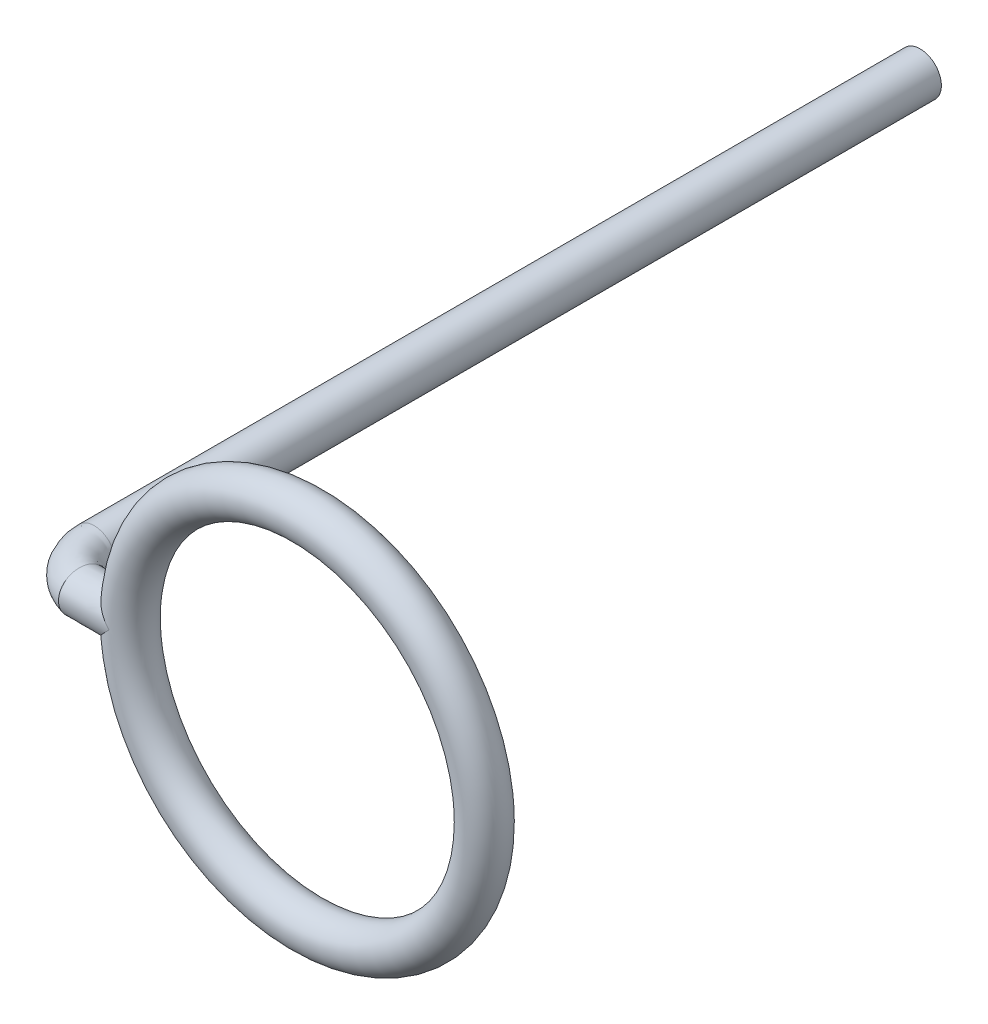
ISO-10303-21;
HEADER;
FILE_DESCRIPTION(('STEP AP214'),'2;1');
FILE_NAME('part.step','',(''),(''),'','','');
FILE_SCHEMA(('AUTOMOTIVE_DESIGN { 1 0 10303 214 1 1 1 1 }'));
ENDSEC;
DATA;
#1=APPLICATION_CONTEXT('core data for automotive mechanical design processes');
#2=APPLICATION_PROTOCOL_DEFINITION('international standard','automotive_design',2000,#1);
#3=PRODUCT_CONTEXT('',#1,'mechanical');
#4=PRODUCT('Part','Part','',(#3));
#5=PRODUCT_RELATED_PRODUCT_CATEGORY('part','',(#4));
#6=PRODUCT_DEFINITION_FORMATION('','',#4);
#7=PRODUCT_DEFINITION_CONTEXT('part definition',#1,'design');
#8=PRODUCT_DEFINITION('design','',#6,#7);
#9=PRODUCT_DEFINITION_SHAPE('','',#8);
#10=(LENGTH_UNIT() NAMED_UNIT(*) SI_UNIT(.MILLI.,.METRE.));
#11=(NAMED_UNIT(*) PLANE_ANGLE_UNIT() SI_UNIT($,.RADIAN.));
#12=(NAMED_UNIT(*) SI_UNIT($,.STERADIAN.) SOLID_ANGLE_UNIT());
#13=UNCERTAINTY_MEASURE_WITH_UNIT(LENGTH_MEASURE(1.E-05),#10,'distance_accuracy_value','');
#14=(GEOMETRIC_REPRESENTATION_CONTEXT(3) GLOBAL_UNCERTAINTY_ASSIGNED_CONTEXT((#13)) GLOBAL_UNIT_ASSIGNED_CONTEXT((#10,
#11,#12)) REPRESENTATION_CONTEXT('',''));
#15=CARTESIAN_POINT('',(0.,0.,0.));
#16=DIRECTION('',(0.,0.,1.));
#17=DIRECTION('',(1.,0.,0.));
#18=AXIS2_PLACEMENT_3D('',#15,#16,#17);
#19=CARTESIAN_POINT('',(0.692087106504282,0.,5.280473238298));
#20=CARTESIAN_POINT('',(1.6204189946439,0.,5.280473238298));
#21=CARTESIAN_POINT('',(0.692087106504282,-0.9,5.280473238298));
#22=CARTESIAN_POINT('',(1.6204189946439,-0.9,5.280473238298));
#23=CARTESIAN_POINT('',(0.548750882783522,-0.9,6.180473238298));
#24=CARTESIAN_POINT('',(1.6204189946439,-0.9,6.180473238298));
#25=CARTESIAN_POINT('',(0.548750882783522,0.,6.180473238298));
#26=CARTESIAN_POINT('',(1.6204189946439,0.,6.180473238298));
#27=CARTESIAN_POINT('',(0.548750882783522,0.9,6.180473238298));
#28=CARTESIAN_POINT('',(1.6204189946439,0.9,6.180473238298));
#29=CARTESIAN_POINT('',(0.692087106504282,0.9,5.280473238298));
#30=CARTESIAN_POINT('',(1.6204189946439,0.9,5.280473238298));
#31=CARTESIAN_POINT('',(0.692087106504282,0.,5.280473238298));
#32=CARTESIAN_POINT('',(1.6204189946439,0.,5.280473238298));
#33=(BOUNDED_SURFACE() B_SPLINE_SURFACE(3,1,((#19,#20),(#21,#22),(#23,#24),(#25,#26),(#27,#28),
(#29,#30),(#31,#32)),.UNSPECIFIED.,.T.,.F.,.F.) B_SPLINE_SURFACE_WITH_KNOTS((4,3,4),(2,2),(0.,
0.5,1.),(0.,1.),.UNSPECIFIED.) GEOMETRIC_REPRESENTATION_ITEM() RATIONAL_B_SPLINE_SURFACE(((1.,
1.),(0.333333333333333,0.333333333333333),(0.333333333333333,0.333333333333333),(1.,1.),
(0.333333333333333,0.333333333333333),(0.333333333333333,0.333333333333333),(1.,1.))) REPRESENTATION_ITEM('') SURFACE());
#34=CARTESIAN_POINT('',(0.692087106504282,0.,5.280473238298));
#35=CARTESIAN_POINT('',(0.692087106504282,-0.9,5.280473238298));
#36=CARTESIAN_POINT('',(0.548750882783522,-0.9,6.180473238298));
#37=CARTESIAN_POINT('',(0.548750882783522,0.,6.180473238298));
#38=CARTESIAN_POINT('',(0.548750882783522,0.9,6.180473238298));
#39=CARTESIAN_POINT('',(0.692087106504282,0.9,5.280473238298));
#40=CARTESIAN_POINT('',(0.692087106504282,0.,5.280473238298));
#41=(BOUNDED_CURVE() B_SPLINE_CURVE(3,(#34,#35,#36,#37,#38,#39,#40),.UNSPECIFIED.,.T.,
.F.) B_SPLINE_CURVE_WITH_KNOTS((4,3,4),(0.,0.5,1.),
.UNSPECIFIED.) CURVE() GEOMETRIC_REPRESENTATION_ITEM() RATIONAL_B_SPLINE_CURVE((1.,
0.333333333333333,0.333333333333333,1.,0.333333333333333,0.333333333333333,1.)) REPRESENTATION_ITEM(''));
#42=CARTESIAN_POINT('',(0.692087106504282,0.,5.280473238298));
#43=VERTEX_POINT('',#42);
#44=EDGE_CURVE('E101',#43,#43,#41,.T.);
#45=CARTESIAN_POINT('',(1.6204189946439,0.,5.280473238298));
#46=CARTESIAN_POINT('',(1.61941904394034,0.000999946876960624,5.28047324780267));
#47=CARTESIAN_POINT('',(1.6184192394614,0.00200015154738658,5.28047658026686));
#48=CARTESIAN_POINT('',(1.58406334565922,0.0363836482557454,5.28070554534993));
#49=CARTESIAN_POINT('',(1.55088460140851,0.070037863780571,5.28463520916479));
#50=CARTESIAN_POINT('',(1.48580900300333,0.136884849147878,5.30042143625995));
#51=CARTESIAN_POINT('',(1.45391435748275,0.17007676467031,5.3122910863468));
#52=CARTESIAN_POINT('',(1.40209298725816,0.22462113528113,5.33974433391434));
#53=CARTESIAN_POINT('',(1.38149986245629,0.246478078776622,5.35306657364809));
#54=CARTESIAN_POINT('',(1.34212986683366,0.288563806025971,5.38418784939207));
#55=CARTESIAN_POINT('',(1.32334931384276,0.308795875977241,5.40197753316593));
#56=CARTESIAN_POINT('',(1.29232278851944,0.342424520449592,5.43771967668645));
#57=CARTESIAN_POINT('',(1.27955731858125,0.35633481212908,5.45473483432355));
#58=CARTESIAN_POINT('',(1.25609635780187,0.382001828345615,5.49156709192732));
#59=CARTESIAN_POINT('',(1.24539654335557,0.393763048260985,5.51137818582118));
#60=CARTESIAN_POINT('',(1.22830966023749,0.412601310692488,5.54982594857071));
#61=CARTESIAN_POINT('',(1.22149399019761,0.420139440516269,5.56804460436168));
#62=CARTESIAN_POINT('',(1.21000368808957,0.432869652899493,5.60589056219817));
#63=CARTESIAN_POINT('',(1.20532419194691,0.438067064913914,5.62551454513834));
#64=CARTESIAN_POINT('',(1.19836007088145,0.445808418696342,5.66583198591937));
#65=CARTESIAN_POINT('',(1.19609053228308,0.448335644624438,5.68653133976306));
#66=CARTESIAN_POINT('',(1.19416723320949,0.450477026420196,5.72820060831059));
#67=CARTESIAN_POINT('',(1.19451271030928,0.450092031365012,5.74917044237427));
#68=CARTESIAN_POINT('',(1.19763995875578,0.446611067684256,5.78876274060493));
#69=CARTESIAN_POINT('',(1.2001985734764,0.443763420056401,5.80742598478644));
#70=CARTESIAN_POINT('',(1.20730383689193,0.43586870444032,5.84390779889929));
#71=CARTESIAN_POINT('',(1.21185322130763,0.430818609876128,5.86172516894683));
#72=CARTESIAN_POINT('',(1.22292219105501,0.418559757229232,5.89680646832661));
#73=CARTESIAN_POINT('',(1.22951274193344,0.411273348302757,5.914020443538));
#74=CARTESIAN_POINT('',(1.244304482224,0.394968807007596,5.94689302038005));
#75=CARTESIAN_POINT('',(1.25250905179435,0.385947041264559,5.96254825216469));
#76=CARTESIAN_POINT('',(1.27439154273928,0.361969700312041,5.99908664082296));
#77=CARTESIAN_POINT('',(1.28883431319464,0.346212723509594,6.01898895451767));
#78=CARTESIAN_POINT('',(1.31981268515193,0.312622630298804,6.05509371462596));
#79=CARTESIAN_POINT('',(1.33635375728122,0.29478409703031,6.07128616745605));
#80=CARTESIAN_POINT('',(1.37688223951206,0.251373249493009,6.1050460895669));
#81=CARTESIAN_POINT('',(1.40147593369138,0.225248976255948,6.12117575427451));
#82=CARTESIAN_POINT('',(1.45233645182983,0.171762547349888,6.14747230854796));
#83=CARTESIAN_POINT('',(1.47860405956399,0.144399813561013,6.15763638176859));
#84=CARTESIAN_POINT('',(1.54201686413544,0.0790441940978801,6.17519381090207));
#85=CARTESIAN_POINT('',(1.5796242701661,0.0408263957298755,6.18021119751048));
#86=CARTESIAN_POINT('',(1.61841926800301,0.00200012019441651,6.18046990047325));
#87=CARTESIAN_POINT('',(1.61941907306654,0.000999914867427577,6.18047323299266));
#88=CARTESIAN_POINT('',(1.6204189946439,0.,6.180473238298));
#89=B_SPLINE_CURVE_WITH_KNOTS('',3,(#45,#46,#47,#48,#49,#50,#51,#52,#53,#54,#55,#56,#57,#58,#59,
#60,#61,#62,#63,#64,#65,#66,#67,#68,#69,#70,#71,#72,#73,#74,#75,#76,#77,#78,#79,#80,#81,#82,#83,
#84,#85,#86,#87,#88),.UNSPECIFIED.,.F.,.F.,(4,2,2,2,2,2,2,2,2,2,2,2,2,2,2,2,2,2,2,2,2,4),(0.,
0.00424265256668993,0.145811875846178,0.287615012502882,0.385852716381518,0.483886457296574,
0.559861709080372,0.635676171371781,0.698003838941149,0.7601888695152,0.822760923770118,
0.885314735434998,0.942211371099444,0.999186441016014,1.05842054661309,1.11778004981022,
1.2049112373805,1.29227444839608,1.40964278906166,1.52706649463792,1.68747128033579,
1.69171393290248),.UNSPECIFIED.);
#90=CARTESIAN_POINT('',(1.6204189946439,0.,5.280473238298));
#91=VERTEX_POINT('',#90);
#92=CARTESIAN_POINT('',(1.6204189946439,0.,6.180473238298));
#93=VERTEX_POINT('',#92);
#94=EDGE_CURVE('E12',#91,#93,#89,.T.);
#95=CARTESIAN_POINT('',(1.6204189946439,0.,5.280473238298));
#96=CARTESIAN_POINT('',(1.61941904394034,-0.000999946876960653,5.28047324780267));
#97=CARTESIAN_POINT('',(1.6184192394614,-0.0020001515473866,5.28047658026686));
#98=CARTESIAN_POINT('',(1.58406334565923,-0.0363836482557363,5.28070554534993));
#99=CARTESIAN_POINT('',(1.55088460140849,-0.0700378637805496,5.2846352091647));
#100=CARTESIAN_POINT('',(1.48580900300341,-0.136884849147847,5.30042143626004));
#101=CARTESIAN_POINT('',(1.45391435748295,-0.170076764670282,5.31229108634716));
#102=CARTESIAN_POINT('',(1.40209298725829,-0.224621135281125,5.33974433391461));
#103=CARTESIAN_POINT('',(1.38149986245632,-0.246478078776632,5.35306657364817));
#104=CARTESIAN_POINT('',(1.34212986683361,-0.288563806025985,5.38418784939201));
#105=CARTESIAN_POINT('',(1.32334931384275,-0.308795875977245,5.40197753316592));
#106=CARTESIAN_POINT('',(1.29232278851945,-0.342424520449591,5.43771967668646));
#107=CARTESIAN_POINT('',(1.27955731858125,-0.356334812129081,5.45473483432356));
#108=CARTESIAN_POINT('',(1.25609635780186,-0.382001828345617,5.49156709192731));
#109=CARTESIAN_POINT('',(1.24539654335556,-0.393763048260986,5.51137818582118));
#110=CARTESIAN_POINT('',(1.22830966023749,-0.412601310692487,5.54982594857071));
#111=CARTESIAN_POINT('',(1.22149399019761,-0.420139440516268,5.56804460436167));
#112=CARTESIAN_POINT('',(1.21000368808957,-0.432869652899493,5.60589056219816));
#113=CARTESIAN_POINT('',(1.20532419194691,-0.438067064913914,5.62551454513834));
#114=CARTESIAN_POINT('',(1.19836007088145,-0.445808418696342,5.66583198591937));
#115=CARTESIAN_POINT('',(1.19609053228308,-0.448335644624438,5.68653133976306));
#116=CARTESIAN_POINT('',(1.19416723320949,-0.450477026420196,5.72820060831059));
#117=CARTESIAN_POINT('',(1.19451271030928,-0.450092031365012,5.74917044237427));
#118=CARTESIAN_POINT('',(1.19763995875578,-0.446611067684255,5.78876274060494));
#119=CARTESIAN_POINT('',(1.2001985734764,-0.4437634200564,5.80742598478645));
#120=CARTESIAN_POINT('',(1.20730383689193,-0.435868704440319,5.84390779889929));
#121=CARTESIAN_POINT('',(1.21185322130763,-0.430818609876127,5.86172516894684));
#122=CARTESIAN_POINT('',(1.22292219105501,-0.41855975722923,5.89680646832661));
#123=CARTESIAN_POINT('',(1.22951274193345,-0.411273348302756,5.914020443538));
#124=CARTESIAN_POINT('',(1.244304482224,-0.394968807007594,5.94689302038005));
#125=CARTESIAN_POINT('',(1.25250905179435,-0.385947041264556,5.96254825216469));
#126=CARTESIAN_POINT('',(1.27439154273928,-0.361969700312038,5.99908664082296));
#127=CARTESIAN_POINT('',(1.28883431319464,-0.346212723509591,6.01898895451767));
#128=CARTESIAN_POINT('',(1.31981268515194,-0.312622630298801,6.05509371462597));
#129=CARTESIAN_POINT('',(1.33635375728123,-0.294784097030305,6.07128616745605));
#130=CARTESIAN_POINT('',(1.37688223951207,-0.251373249493002,6.10504608956691));
#131=CARTESIAN_POINT('',(1.40147593369138,-0.225248976255941,6.12117575427451));
#132=CARTESIAN_POINT('',(1.45233645182983,-0.171762547349877,6.14747230854797));
#133=CARTESIAN_POINT('',(1.47860405956399,-0.144399813560998,6.15763638176859));
#134=CARTESIAN_POINT('',(1.54201686413546,-0.0790441940978838,6.17519381090206));
#135=CARTESIAN_POINT('',(1.57962427016614,-0.0408263957299113,6.18021119751044));
#136=CARTESIAN_POINT('',(1.61841926800301,-0.00200012019441843,6.18046990047325));
#137=CARTESIAN_POINT('',(1.61941907306654,-0.000999914867428478,6.18047323299266));
#138=CARTESIAN_POINT('',(1.6204189946439,0.,6.180473238298));
#139=B_SPLINE_CURVE_WITH_KNOTS('',3,(#95,#96,#97,#98,#99,#100,#101,#102,#103,#104,#105,#106,
#107,#108,#109,#110,#111,#112,#113,#114,#115,#116,#117,#118,#119,#120,#121,#122,#123,#124,#125,
#126,#127,#128,#129,#130,#131,#132,#133,#134,#135,#136,#137,#138),.UNSPECIFIED.,.F.,.F.,(4,2,2,
2,2,2,2,2,2,2,2,2,2,2,2,2,2,2,2,2,2,4),(0.,0.00424265256668962,0.145811875846129,
0.287615012502841,0.385852716381489,0.483886457296516,0.559861709080321,0.635676171371725,
0.698003838941092,0.760188869515146,0.822760923770065,0.885314735434947,0.942211371099393,
0.999186441015962,1.05842054661304,1.11778004981017,1.20491123738045,1.29227444839603,
1.40964278906162,1.52706649463787,1.68747128033573,1.69171393290242),.UNSPECIFIED.);
#140=EDGE_CURVE('E52',#93,#91,#139,.F.);
#141=ORIENTED_EDGE('',*,*,#44,.F.);
#142=EDGE_LOOP('',(#141));
#143=FACE_BOUND('',#142,.T.);
#144=ORIENTED_EDGE('',*,*,#94,.F.);
#145=ORIENTED_EDGE('',*,*,#140,.F.);
#146=EDGE_LOOP('',(#144,#145));
#147=FACE_BOUND('',#146,.T.);
#148=ADVANCED_FACE('F39',(#143,#147),#33,.F.);
#149=CARTESIAN_POINT('',(0.,0.,4.875));
#150=DIRECTION('',(0.,0.,-1.));
#151=DIRECTION('',(-1.,0.,0.));
#152=AXIS2_PLACEMENT_3D('',#149,#150,#151);
#153=CYLINDRICAL_SURFACE('',#152,0.45);
#154=CARTESIAN_POINT('',(0.,0.,4.875));
#155=DIRECTION('',(0.,0.,1.));
#156=DIRECTION('',(1.,0.,0.));
#157=AXIS2_PLACEMENT_3D('',#154,#155,#156);
#158=CIRCLE('',#157,0.45);
#159=CARTESIAN_POINT('',(0.45,0.,4.875));
#160=VERTEX_POINT('',#159);
#161=EDGE_CURVE('E60',#160,#160,#158,.T.);
#162=ORIENTED_EDGE('',*,*,#161,.F.);
#163=EDGE_LOOP('',(#162));
#164=FACE_BOUND('',#163,.T.);
#165=CARTESIAN_POINT('',(0.,0.,-12.625));
#166=DIRECTION('',(0.,0.,1.));
#167=DIRECTION('',(1.,0.,0.));
#168=AXIS2_PLACEMENT_3D('',#165,#166,#167);
#169=CIRCLE('',#168,0.45);
#170=CARTESIAN_POINT('',(0.45,0.,-12.625));
#171=VERTEX_POINT('',#170);
#172=EDGE_CURVE('E62',#171,#171,#169,.T.);
#173=ORIENTED_EDGE('',*,*,#172,.T.);
#174=EDGE_LOOP('',(#173));
#175=FACE_BOUND('',#174,.T.);
#176=ADVANCED_FACE('F41',(#164,#175),#153,.T.);
#177=CARTESIAN_POINT('',(0.,0.,-12.625));
#178=DIRECTION('',(0.,0.,1.));
#179=DIRECTION('',(1.,0.,0.));
#180=AXIS2_PLACEMENT_3D('',#177,#178,#179);
#181=PLANE('',#180);
#182=ORIENTED_EDGE('',*,*,#172,.F.);
#183=EDGE_LOOP('',(#182));
#184=FACE_BOUND('',#183,.T.);
#185=ADVANCED_FACE('F85',(#184),#181,.F.);
#186=CARTESIAN_POINT('',(0.45,0.,4.875));
#187=CARTESIAN_POINT('',(0.45,0.,4.94284415358782));
#188=CARTESIAN_POINT('',(0.456282728459389,0.,4.94431537626742));
#189=CARTESIAN_POINT('',(0.486321521665883,0.,5.06596935075954));
#190=CARTESIAN_POINT('',(0.52816734089369,0.,5.1327897767991));
#191=CARTESIAN_POINT('',(0.573868134181102,0.,5.19465223346691));
#192=CARTESIAN_POINT('',(0.652079858365823,0.,5.24742595508101));
#193=CARTESIAN_POINT('',(0.641468262870593,0.,5.26393026937798));
#194=CARTESIAN_POINT('',(0.692087106504283,0.,5.280473238298));
#195=CARTESIAN_POINT('',(0.45,0.9,4.875));
#196=CARTESIAN_POINT('',(0.45,0.9,5.05789190931659));
#197=CARTESIAN_POINT('',(0.456615773705222,0.9,4.88825065190883));
#198=CARTESIAN_POINT('',(0.485086463503013,0.9,5.08128264866202));
#199=CARTESIAN_POINT('',(0.532387407509551,0.9,5.13094128155833));
#200=CARTESIAN_POINT('',(0.561978408903085,0.9,5.19152912770658));
#201=CARTESIAN_POINT('',(0.695112978059704,0.9,5.26128344342246));
#202=CARTESIAN_POINT('',(0.552712243855055,0.9,5.23492352092944));
#203=CARTESIAN_POINT('',(0.692087106504283,0.9,5.280473238298));
#204=CARTESIAN_POINT('',(-0.45,0.9,4.875));
#205=CARTESIAN_POINT('',(-0.45,0.9,5.05789190931659));
#206=CARTESIAN_POINT('',(-0.421207291257578,0.9,5.16481407245347));
#207=CARTESIAN_POINT('',(-0.311393454863875,0.9,5.51254474159091));
#208=CARTESIAN_POINT('',(-0.125647612043174,0.9,5.767701168994));
#209=CARTESIAN_POINT('',(0.079885783254905,0.9,5.9600777116774));
#210=CARTESIAN_POINT('',(0.330992895222854,0.9,6.10686187936765));
#211=CARTESIAN_POINT('',(0.409376020134295,0.9,6.13492352092944));
#212=CARTESIAN_POINT('',(0.548750882783522,0.9,6.180473238298));
#213=CARTESIAN_POINT('',(-0.45,0.,4.875));
#214=CARTESIAN_POINT('',(-0.45,0.,5.00036803145221));
#215=CARTESIAN_POINT('',(-0.421373813880494,0.,5.19284643463276));
#216=CARTESIAN_POINT('',(-0.310775925782441,0.,5.50488809263967));
#217=CARTESIAN_POINT('',(-0.127757645351105,0.,5.76862541661439));
#218=CARTESIAN_POINT('',(0.0858306458939142,0.,5.96163926455756));
#219=CARTESIAN_POINT('',(0.309476335375912,0.,6.09993313519693));
#220=CARTESIAN_POINT('',(0.453754029642064,0.,6.14942689515371));
#221=CARTESIAN_POINT('',(0.548750882783522,0.,6.180473238298));
#222=CARTESIAN_POINT('',(-0.45,-0.9,4.875));
#223=CARTESIAN_POINT('',(-0.45,-0.9,4.94284415358782));
#224=CARTESIAN_POINT('',(-0.421540336503411,-0.9,5.22087879681206));
#225=CARTESIAN_POINT('',(-0.310158396701006,-0.9,5.49723144368843));
#226=CARTESIAN_POINT('',(-0.129867678659036,-0.9,5.76954966423477));
#227=CARTESIAN_POINT('',(0.0917755085329233,-0.9,5.96320081743772));
#228=CARTESIAN_POINT('',(0.287959775528972,-0.9,6.09300439102621));
#229=CARTESIAN_POINT('',(0.498132039149833,-0.9,6.16393026937798));
#230=CARTESIAN_POINT('',(0.548750882783522,-0.9,6.180473238298));
#231=CARTESIAN_POINT('',(0.45,-0.9,4.875));
#232=CARTESIAN_POINT('',(0.45,-0.9,4.82779639785905));
#233=CARTESIAN_POINT('',(0.455949683213556,-0.9,5.00038010062602));
#234=CARTESIAN_POINT('',(0.487556579828751,-0.9,5.05065605285706));
#235=CARTESIAN_POINT('',(0.523947274277827,-0.9,5.13463827203988));
#236=CARTESIAN_POINT('',(0.585757859459121,-0.9,5.19777533922722));
#237=CARTESIAN_POINT('',(0.609046738671941,-0.9,5.23356846673957));
#238=CARTESIAN_POINT('',(0.730224281886131,-0.9,5.29293701782653));
#239=CARTESIAN_POINT('',(0.692087106504283,-0.9,5.280473238298));
#240=CARTESIAN_POINT('',(0.45,0.,4.875));
#241=CARTESIAN_POINT('',(0.45,0.,4.94284415358782));
#242=CARTESIAN_POINT('',(0.456282728459389,0.,4.94431537626742));
#243=CARTESIAN_POINT('',(0.486321521665883,0.,5.06596935075954));
#244=CARTESIAN_POINT('',(0.52816734089369,0.,5.1327897767991));
#245=CARTESIAN_POINT('',(0.573868134181102,0.,5.19465223346691));
#246=CARTESIAN_POINT('',(0.652079858365823,0.,5.24742595508101));
#247=CARTESIAN_POINT('',(0.641468262870593,0.,5.26393026937798));
#248=CARTESIAN_POINT('',(0.692087106504283,0.,5.280473238298));
#249=(BOUNDED_SURFACE() B_SPLINE_SURFACE(3,3,((#186,#187,#188,#189,#190,#191,#192,#193,#194),
(#195,#196,#197,#198,#199,#200,#201,#202,#203),(#204,#205,#206,#207,#208,#209,#210,#211,#212),
(#213,#214,#215,#216,#217,#218,#219,#220,#221),(#222,#223,#224,#225,#226,#227,#228,#229,#230),
(#231,#232,#233,#234,#235,#236,#237,#238,#239),(#240,#241,#242,#243,#244,#245,#246,#247,#248)),
.UNSPECIFIED.,.T.,.F.,.F.) B_SPLINE_SURFACE_WITH_KNOTS((4,3,4),(4,1,1,1,1,1,4),(0.,0.5,1.),(0.,
0.180308680805076,0.369593476277659,0.561429421360296,0.711540361964005,0.858891388172645,1.),
.UNSPECIFIED.) GEOMETRIC_REPRESENTATION_ITEM() RATIONAL_B_SPLINE_SURFACE(((1.,1.,1.,1.,1.,1.,1.,
1.,1.),(0.333333333333333,0.333333333333333,0.333333333333333,0.333333333333333,
0.333333333333333,0.333333333333333,0.333333333333333,0.333333333333333,0.333333333333333),
(0.333333333333333,0.333333333333333,0.333333333333333,0.333333333333333,0.333333333333333,
0.333333333333333,0.333333333333333,0.333333333333333,0.333333333333333),(1.,1.,1.,1.,1.,1.,1.,
1.,1.),(0.333333333333333,0.333333333333333,0.333333333333333,0.333333333333333,
0.333333333333333,0.333333333333333,0.333333333333333,0.333333333333333,0.333333333333333),
(0.333333333333333,0.333333333333333,0.333333333333333,0.333333333333333,0.333333333333333,
0.333333333333333,0.333333333333333,0.333333333333333,0.333333333333333),(1.,1.,1.,1.,1.,1.,1.,
1.,1.))) REPRESENTATION_ITEM('') SURFACE());
#250=ORIENTED_EDGE('',*,*,#161,.T.);
#251=EDGE_LOOP('',(#250));
#252=FACE_BOUND('',#251,.T.);
#253=ORIENTED_EDGE('',*,*,#44,.T.);
#254=EDGE_LOOP('',(#253));
#255=FACE_BOUND('',#254,.T.);
#256=ADVANCED_FACE('F75',(#252,#255),#249,.T.);
#257=CARTESIAN_POINT('',(5.3704189946439,0.,5.730473238298));
#258=DIRECTION('',(0.,0.,-1.));
#259=DIRECTION('',(-1.,0.,0.));
#260=AXIS2_PLACEMENT_3D('',#257,#258,#259);
#261=TOROIDAL_SURFACE('',#260,3.75,0.45);
#262=ORIENTED_EDGE('',*,*,#140,.T.);
#263=ORIENTED_EDGE('',*,*,#94,.T.);
#264=EDGE_LOOP('',(#262,#263));
#265=FACE_BOUND('',#264,.T.);
#266=ADVANCED_FACE('F59',(#265),#261,.T.);
#267=CLOSED_SHELL('',(#148,#176,#185,#256,#266));
#268=MANIFOLD_SOLID_BREP('B2',#267);
#269=ADVANCED_BREP_SHAPE_REPRESENTATION('',(#18,#268),#14);
#270=SHAPE_DEFINITION_REPRESENTATION(#9,#269);
ENDSEC;
END-ISO-10303-21;
